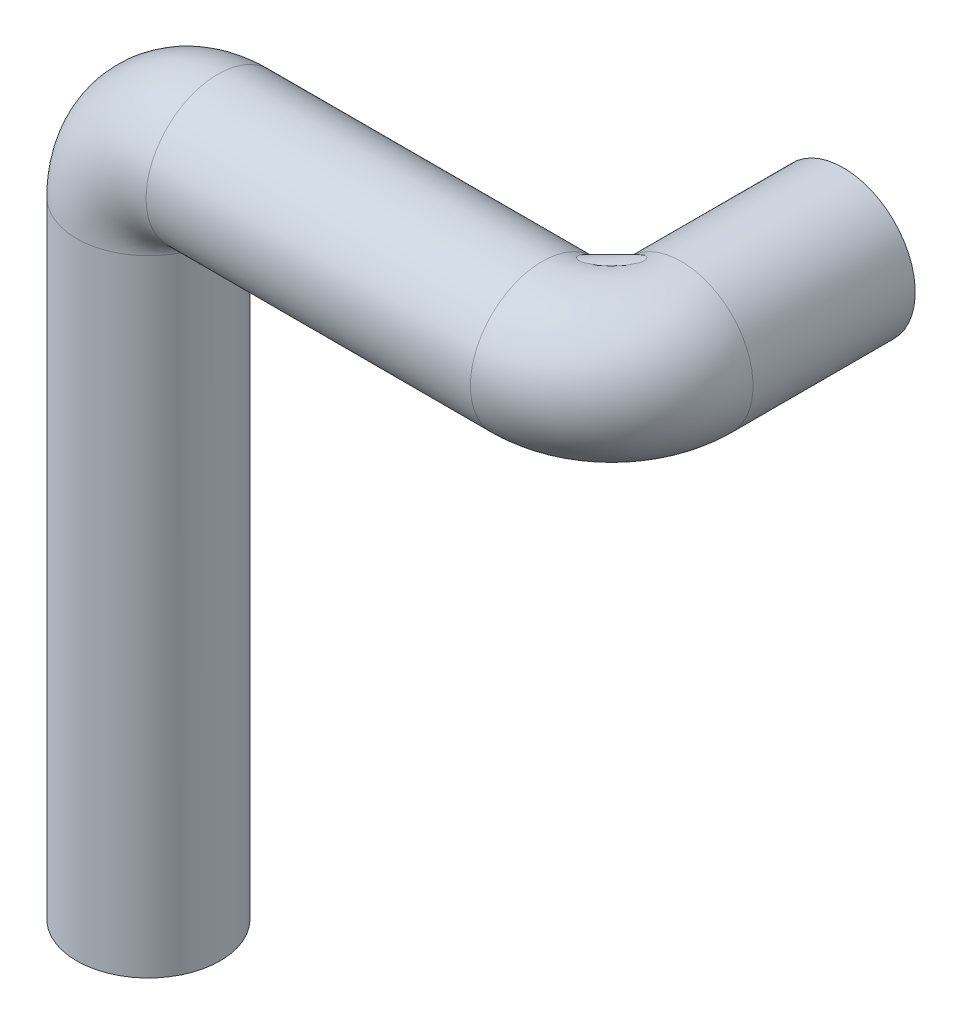
ISO-10303-21;
HEADER;
FILE_DESCRIPTION(('STEP AP214'),'2;1');
FILE_NAME('part.step','',(''),(''),'','','');
FILE_SCHEMA(('AUTOMOTIVE_DESIGN { 1 0 10303 214 1 1 1 1 }'));
ENDSEC;
DATA;
#1=APPLICATION_CONTEXT('core data for automotive mechanical design processes');
#2=APPLICATION_PROTOCOL_DEFINITION('international standard','automotive_design',2000,#1);
#3=PRODUCT_CONTEXT('',#1,'mechanical');
#4=PRODUCT('Part','Part','',(#3));
#5=PRODUCT_RELATED_PRODUCT_CATEGORY('part','',(#4));
#6=PRODUCT_DEFINITION_FORMATION('','',#4);
#7=PRODUCT_DEFINITION_CONTEXT('part definition',#1,'design');
#8=PRODUCT_DEFINITION('design','',#6,#7);
#9=PRODUCT_DEFINITION_SHAPE('','',#8);
#10=(LENGTH_UNIT() NAMED_UNIT(*) SI_UNIT(.MILLI.,.METRE.));
#11=(NAMED_UNIT(*) PLANE_ANGLE_UNIT() SI_UNIT($,.RADIAN.));
#12=(NAMED_UNIT(*) SI_UNIT($,.STERADIAN.) SOLID_ANGLE_UNIT());
#13=UNCERTAINTY_MEASURE_WITH_UNIT(LENGTH_MEASURE(1.E-05),#10,'distance_accuracy_value','');
#14=(GEOMETRIC_REPRESENTATION_CONTEXT(3) GLOBAL_UNCERTAINTY_ASSIGNED_CONTEXT((#13)) GLOBAL_UNIT_ASSIGNED_CONTEXT((#10,
#11,#12)) REPRESENTATION_CONTEXT('',''));
#15=CARTESIAN_POINT('',(0.,0.,0.));
#16=DIRECTION('',(0.,0.,1.));
#17=DIRECTION('',(1.,0.,0.));
#18=AXIS2_PLACEMENT_3D('',#15,#16,#17);
#19=CARTESIAN_POINT('',(0.,0.,0.));
#20=DIRECTION('',(0.,1.,0.));
#21=DIRECTION('',(0.,0.,1.));
#22=AXIS2_PLACEMENT_3D('',#19,#20,#21);
#23=CYLINDRICAL_SURFACE('',#22,31.);
#24=CARTESIAN_POINT('',(0.,0.,0.));
#25=DIRECTION('',(0.,1.,0.));
#26=DIRECTION('',(0.,0.,1.));
#27=AXIS2_PLACEMENT_3D('',#24,#25,#26);
#28=CIRCLE('',#27,31.);
#29=CARTESIAN_POINT('',(0.,0.,31.));
#30=VERTEX_POINT('',#29);
#31=EDGE_CURVE('E85',#30,#30,#28,.T.);
#32=ORIENTED_EDGE('',*,*,#31,.T.);
#33=EDGE_LOOP('',(#32));
#34=FACE_BOUND('',#33,.T.);
#35=CARTESIAN_POINT('',(0.,270.,0.));
#36=DIRECTION('',(0.,-1.,0.));
#37=DIRECTION('',(0.,0.,-1.));
#38=AXIS2_PLACEMENT_3D('',#35,#36,#37);
#39=CIRCLE('',#38,31.);
#40=CARTESIAN_POINT('',(30.,270.,-7.81024967590671));
#41=VERTEX_POINT('',#40);
#42=CARTESIAN_POINT('',(30.,270.,7.81024967590671));
#43=VERTEX_POINT('',#42);
#44=EDGE_CURVE('E86',#41,#43,#39,.F.);
#45=ORIENTED_EDGE('',*,*,#44,.F.);
#46=CARTESIAN_POINT('',(0.,300.,0.));
#47=DIRECTION('',(0.707106781186547,0.707106781186547,0.));
#48=DIRECTION('',(0.707106781186547,-0.707106781186547,0.));
#49=AXIS2_PLACEMENT_3D('',#46,#47,#48);
#50=ELLIPSE('',#49,43.8406204335659,31.);
#51=EDGE_CURVE('E11',#41,#43,#50,.F.);
#52=ORIENTED_EDGE('',*,*,#51,.T.);
#53=EDGE_LOOP('',(#45,#52));
#54=FACE_BOUND('',#53,.T.);
#55=ADVANCED_FACE('F37',(#34,#54),#23,.T.);
#56=CARTESIAN_POINT('',(30.,300.,0.));
#57=DIRECTION('',(1.,0.,0.));
#58=DIRECTION('',(0.,0.,-1.));
#59=AXIS2_PLACEMENT_3D('',#56,#57,#58);
#60=CYLINDRICAL_SURFACE('',#59,31.);
#61=CARTESIAN_POINT('',(170.,300.,0.));
#62=DIRECTION('',(-1.,0.,0.));
#63=DIRECTION('',(0.,0.,1.));
#64=AXIS2_PLACEMENT_3D('',#61,#62,#63);
#65=CIRCLE('',#64,31.);
#66=CARTESIAN_POINT('',(170.,307.810249675907,-30.));
#67=VERTEX_POINT('',#66);
#68=CARTESIAN_POINT('',(170.,292.189750324093,-30.));
#69=VERTEX_POINT('',#68);
#70=EDGE_CURVE('E91',#67,#69,#65,.F.);
#71=ORIENTED_EDGE('',*,*,#70,.F.);
#72=CARTESIAN_POINT('',(200.,300.,0.));
#73=DIRECTION('',(0.707106781186547,0.,-0.707106781186547));
#74=DIRECTION('',(-0.707106781186547,0.,-0.707106781186547));
#75=AXIS2_PLACEMENT_3D('',#72,#73,#74);
#76=ELLIPSE('',#75,43.8406204335659,31.);
#77=EDGE_CURVE('E45',#67,#69,#76,.F.);
#78=ORIENTED_EDGE('',*,*,#77,.T.);
#79=EDGE_LOOP('',(#71,#78));
#80=FACE_BOUND('',#79,.T.);
#81=ORIENTED_EDGE('',*,*,#51,.F.);
#82=CARTESIAN_POINT('',(30.,300.,0.));
#83=DIRECTION('',(1.,0.,0.));
#84=DIRECTION('',(0.,0.,-1.));
#85=AXIS2_PLACEMENT_3D('',#82,#83,#84);
#86=CIRCLE('',#85,31.);
#87=EDGE_CURVE('E89',#41,#43,#86,.T.);
#88=ORIENTED_EDGE('',*,*,#87,.T.);
#89=EDGE_LOOP('',(#81,#88));
#90=FACE_BOUND('',#89,.T.);
#91=ADVANCED_FACE('F107',(#80,#90),#60,.T.);
#92=CARTESIAN_POINT('',(200.,300.,-30.));
#93=DIRECTION('',(0.,0.,-1.));
#94=DIRECTION('',(-1.,0.,0.));
#95=AXIS2_PLACEMENT_3D('',#92,#93,#94);
#96=CYLINDRICAL_SURFACE('',#95,31.);
#97=CARTESIAN_POINT('',(200.,300.,-100.));
#98=DIRECTION('',(0.,0.,-1.));
#99=DIRECTION('',(-1.,0.,0.));
#100=AXIS2_PLACEMENT_3D('',#97,#98,#99);
#101=CIRCLE('',#100,31.);
#102=CARTESIAN_POINT('',(169.,300.,-100.));
#103=VERTEX_POINT('',#102);
#104=EDGE_CURVE('E96',#103,#103,#101,.T.);
#105=ORIENTED_EDGE('',*,*,#104,.F.);
#106=EDGE_LOOP('',(#105));
#107=FACE_BOUND('',#106,.T.);
#108=ORIENTED_EDGE('',*,*,#77,.F.);
#109=CARTESIAN_POINT('',(200.,300.,-30.));
#110=DIRECTION('',(0.,0.,-1.));
#111=DIRECTION('',(-1.,0.,0.));
#112=AXIS2_PLACEMENT_3D('',#109,#110,#111);
#113=CIRCLE('',#112,31.);
#114=EDGE_CURVE('E94',#67,#69,#113,.T.);
#115=ORIENTED_EDGE('',*,*,#114,.T.);
#116=EDGE_LOOP('',(#108,#115));
#117=FACE_BOUND('',#116,.T.);
#118=ADVANCED_FACE('F39',(#107,#117),#96,.T.);
#119=CARTESIAN_POINT('',(0.,0.,0.));
#120=DIRECTION('',(0.,1.,0.));
#121=DIRECTION('',(0.,0.,1.));
#122=AXIS2_PLACEMENT_3D('',#119,#120,#121);
#123=PLANE('',#122);
#124=CARTESIAN_POINT('',(0.,0.,0.));
#125=DIRECTION('',(0.,1.,0.));
#126=DIRECTION('',(0.,0.,1.));
#127=AXIS2_PLACEMENT_3D('',#124,#125,#126);
#128=CIRCLE('',#127,30.);
#129=CARTESIAN_POINT('',(0.,0.,30.));
#130=VERTEX_POINT('',#129);
#131=EDGE_CURVE('E154',#130,#130,#128,.T.);
#132=ORIENTED_EDGE('',*,*,#131,.T.);
#133=EDGE_LOOP('',(#132));
#134=FACE_BOUND('',#133,.T.);
#135=ORIENTED_EDGE('',*,*,#31,.F.);
#136=EDGE_LOOP('',(#135));
#137=FACE_BOUND('',#136,.T.);
#138=ADVANCED_FACE('F106',(#134,#137),#123,.F.);
#139=CARTESIAN_POINT('',(200.,300.,-100.));
#140=DIRECTION('',(0.,0.,-1.));
#141=DIRECTION('',(1.,0.,0.));
#142=AXIS2_PLACEMENT_3D('',#139,#140,#141);
#143=PLANE('',#142);
#144=CARTESIAN_POINT('',(200.,300.,-100.));
#145=DIRECTION('',(0.,0.,-1.));
#146=DIRECTION('',(1.,0.,0.));
#147=AXIS2_PLACEMENT_3D('',#144,#145,#146);
#148=CIRCLE('',#147,30.);
#149=CARTESIAN_POINT('',(230.,300.,-100.));
#150=VERTEX_POINT('',#149);
#151=EDGE_CURVE('E76',#150,#150,#148,.T.);
#152=ORIENTED_EDGE('',*,*,#151,.F.);
#153=EDGE_LOOP('',(#152));
#154=FACE_BOUND('',#153,.T.);
#155=ORIENTED_EDGE('',*,*,#104,.T.);
#156=EDGE_LOOP('',(#155));
#157=FACE_BOUND('',#156,.T.);
#158=ADVANCED_FACE('F102',(#154,#157),#143,.T.);
#159=CARTESIAN_POINT('',(0.,270.,0.));
#160=DIRECTION('',(0.,-1.,0.));
#161=DIRECTION('',(-1.,0.,0.));
#162=AXIS2_PLACEMENT_3D('',#159,#160,#161);
#163=CIRCLE('',#162,31.);
#164=TRIMMED_CURVE('',#163,(PARAMETER_VALUE(-2.88690459932043)),
(PARAMETER_VALUE(2.88690459932043)),.T.,.PARAMETER.);
#165=CARTESIAN_POINT('',(30.,270.,0.));
#166=DIRECTION('',(0.,0.,-1.));
#167=AXIS1_PLACEMENT('',#165,#166);
#168=SURFACE_OF_REVOLUTION('',#164,#167);
#169=ORIENTED_EDGE('',*,*,#87,.F.);
#170=ORIENTED_EDGE('',*,*,#44,.T.);
#171=EDGE_LOOP('',(#169,#170));
#172=FACE_BOUND('',#171,.T.);
#173=ADVANCED_FACE('F114',(#172),#168,.T.);
#174=CARTESIAN_POINT('',(170.,300.,0.));
#175=DIRECTION('',(-1.,0.,0.));
#176=DIRECTION('',(0.,0.,1.));
#177=AXIS2_PLACEMENT_3D('',#174,#175,#176);
#178=CIRCLE('',#177,31.);
#179=TRIMMED_CURVE('',#178,(PARAMETER_VALUE(-2.88690459932043)),
(PARAMETER_VALUE(2.88690459932043)),.T.,.PARAMETER.);
#180=CARTESIAN_POINT('',(170.,300.,-30.));
#181=DIRECTION('',(0.,1.,0.));
#182=AXIS1_PLACEMENT('',#180,#181);
#183=SURFACE_OF_REVOLUTION('',#179,#182);
#184=ORIENTED_EDGE('',*,*,#114,.F.);
#185=ORIENTED_EDGE('',*,*,#70,.T.);
#186=EDGE_LOOP('',(#184,#185));
#187=FACE_BOUND('',#186,.T.);
#188=ADVANCED_FACE('F108',(#187),#183,.T.);
#189=CARTESIAN_POINT('',(0.,0.,0.));
#190=DIRECTION('',(0.,1.,0.));
#191=DIRECTION('',(0.,0.,1.));
#192=AXIS2_PLACEMENT_3D('',#189,#190,#191);
#193=CYLINDRICAL_SURFACE('',#192,30.);
#194=CARTESIAN_POINT('',(0.,270.,0.));
#195=DIRECTION('',(0.,1.,0.));
#196=DIRECTION('',(0.,0.,1.));
#197=AXIS2_PLACEMENT_3D('',#194,#195,#196);
#198=CIRCLE('',#197,30.);
#199=CARTESIAN_POINT('',(30.,270.,0.));
#200=VERTEX_POINT('',#199);
#201=EDGE_CURVE('E79',#200,#200,#198,.T.);
#202=ORIENTED_EDGE('',*,*,#201,.T.);
#203=EDGE_LOOP('',(#202));
#204=FACE_BOUND('',#203,.T.);
#205=ORIENTED_EDGE('',*,*,#131,.F.);
#206=EDGE_LOOP('',(#205));
#207=FACE_BOUND('',#206,.T.);
#208=ADVANCED_FACE('F113',(#204,#207),#193,.F.);
#209=CARTESIAN_POINT('',(0.,270.,0.));
#210=DIRECTION('',(0.,-1.,0.));
#211=DIRECTION('',(-1.,0.,0.));
#212=AXIS2_PLACEMENT_3D('',#209,#210,#211);
#213=CIRCLE('',#212,30.);
#214=TRIMMED_CURVE('',#213,(PARAMETER_VALUE(-3.14159262378747)),
(PARAMETER_VALUE(3.14159262378747)),.T.,.PARAMETER.);
#215=CARTESIAN_POINT('',(30.,270.,0.));
#216=DIRECTION('',(0.,0.,-1.));
#217=AXIS1_PLACEMENT('',#215,#216);
#218=SURFACE_OF_REVOLUTION('',#214,#217);
#219=CARTESIAN_POINT('',(30.,300.,0.));
#220=DIRECTION('',(1.,0.,0.));
#221=DIRECTION('',(0.,0.,1.));
#222=AXIS2_PLACEMENT_3D('',#219,#220,#221);
#223=CIRCLE('',#222,30.);
#224=EDGE_CURVE('E74',#200,#200,#223,.T.);
#225=ORIENTED_EDGE('',*,*,#224,.T.);
#226=ORIENTED_EDGE('',*,*,#201,.F.);
#227=EDGE_LOOP('',(#225,#226));
#228=FACE_BOUND('',#227,.T.);
#229=ADVANCED_FACE('F119',(#228),#218,.F.);
#230=CARTESIAN_POINT('',(30.,300.,0.));
#231=DIRECTION('',(1.,0.,0.));
#232=DIRECTION('',(0.,0.,-1.));
#233=AXIS2_PLACEMENT_3D('',#230,#231,#232);
#234=CYLINDRICAL_SURFACE('',#233,30.);
#235=CARTESIAN_POINT('',(170.,300.,0.));
#236=DIRECTION('',(1.,0.,0.));
#237=DIRECTION('',(0.,0.,1.));
#238=AXIS2_PLACEMENT_3D('',#235,#236,#237);
#239=CIRCLE('',#238,30.);
#240=CARTESIAN_POINT('',(170.,300.,-30.));
#241=VERTEX_POINT('',#240);
#242=EDGE_CURVE('E69',#241,#241,#239,.T.);
#243=ORIENTED_EDGE('',*,*,#242,.T.);
#244=EDGE_LOOP('',(#243));
#245=FACE_BOUND('',#244,.T.);
#246=ORIENTED_EDGE('',*,*,#224,.F.);
#247=EDGE_LOOP('',(#246));
#248=FACE_BOUND('',#247,.T.);
#249=ADVANCED_FACE('F144',(#245,#248),#234,.F.);
#250=CARTESIAN_POINT('',(170.,300.,-30.));
#251=DIRECTION('',(0.,1.,0.));
#252=DIRECTION('',(0.,0.,1.));
#253=AXIS2_PLACEMENT_3D('',#250,#251,#252);
#254=DEGENERATE_TOROIDAL_SURFACE('',#253,30.,30.,.T.);
#255=CARTESIAN_POINT('',(200.,300.,-30.));
#256=DIRECTION('',(0.,0.,-1.));
#257=DIRECTION('',(1.,0.,0.));
#258=AXIS2_PLACEMENT_3D('',#255,#256,#257);
#259=CIRCLE('',#258,30.);
#260=EDGE_CURVE('E72',#241,#241,#259,.T.);
#261=ORIENTED_EDGE('',*,*,#260,.T.);
#262=ORIENTED_EDGE('',*,*,#242,.F.);
#263=EDGE_LOOP('',(#261,#262));
#264=FACE_BOUND('',#263,.T.);
#265=ADVANCED_FACE('F70',(#264),#254,.F.);
#266=CARTESIAN_POINT('',(200.,300.,-30.));
#267=DIRECTION('',(0.,0.,-1.));
#268=DIRECTION('',(-1.,0.,0.));
#269=AXIS2_PLACEMENT_3D('',#266,#267,#268);
#270=CYLINDRICAL_SURFACE('',#269,30.);
#271=ORIENTED_EDGE('',*,*,#151,.T.);
#272=EDGE_LOOP('',(#271));
#273=FACE_BOUND('',#272,.T.);
#274=ORIENTED_EDGE('',*,*,#260,.F.);
#275=EDGE_LOOP('',(#274));
#276=FACE_BOUND('',#275,.T.);
#277=ADVANCED_FACE('F135',(#273,#276),#270,.F.);
#278=CLOSED_SHELL('',(#55,#91,#118,#138,#158,#173,#188,#208,#229,#249,#265,#277));
#279=MANIFOLD_SOLID_BREP('B2',#278);
#280=ADVANCED_BREP_SHAPE_REPRESENTATION('',(#18,#279),#14);
#281=SHAPE_DEFINITION_REPRESENTATION(#9,#280);
ENDSEC;
END-ISO-10303-21;
